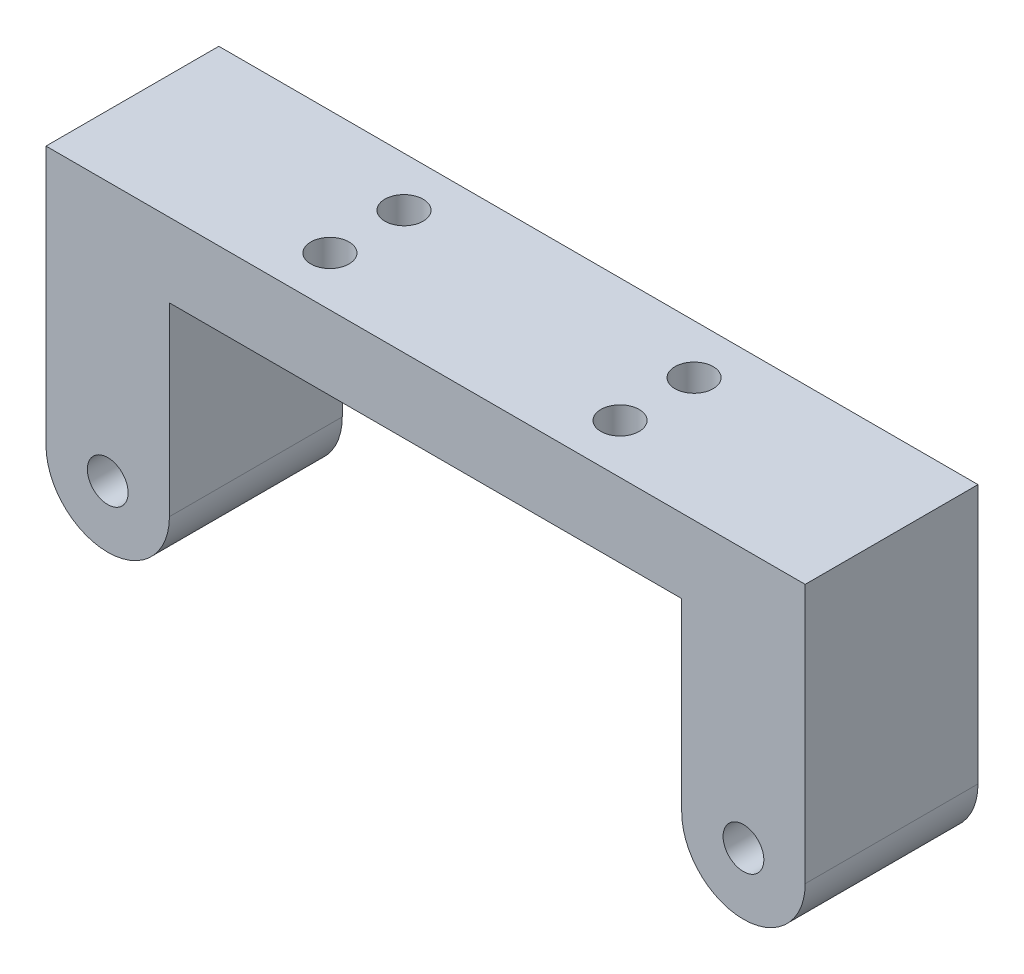
ISO-10303-21;
HEADER;
FILE_DESCRIPTION(('STEP AP214'),'2;1');
FILE_NAME('part.step','',(''),(''),'','','');
FILE_SCHEMA(('AUTOMOTIVE_DESIGN { 1 0 10303 214 1 1 1 1 }'));
ENDSEC;
DATA;
#1=APPLICATION_CONTEXT('core data for automotive mechanical design processes');
#2=APPLICATION_PROTOCOL_DEFINITION('international standard','automotive_design',2000,#1);
#3=PRODUCT_CONTEXT('',#1,'mechanical');
#4=PRODUCT('Part','Part','',(#3));
#5=PRODUCT_RELATED_PRODUCT_CATEGORY('part','',(#4));
#6=PRODUCT_DEFINITION_FORMATION('','',#4);
#7=PRODUCT_DEFINITION_CONTEXT('part definition',#1,'design');
#8=PRODUCT_DEFINITION('design','',#6,#7);
#9=PRODUCT_DEFINITION_SHAPE('','',#8);
#10=(LENGTH_UNIT() NAMED_UNIT(*) SI_UNIT(.MILLI.,.METRE.));
#11=(NAMED_UNIT(*) PLANE_ANGLE_UNIT() SI_UNIT($,.RADIAN.));
#12=(NAMED_UNIT(*) SI_UNIT($,.STERADIAN.) SOLID_ANGLE_UNIT());
#13=UNCERTAINTY_MEASURE_WITH_UNIT(LENGTH_MEASURE(1.E-05),#10,'distance_accuracy_value','');
#14=(GEOMETRIC_REPRESENTATION_CONTEXT(3) GLOBAL_UNCERTAINTY_ASSIGNED_CONTEXT((#13)) GLOBAL_UNIT_ASSIGNED_CONTEXT((#10,
#11,#12)) REPRESENTATION_CONTEXT('',''));
#15=CARTESIAN_POINT('',(0.,0.,0.));
#16=DIRECTION('',(0.,0.,1.));
#17=DIRECTION('',(1.,0.,0.));
#18=AXIS2_PLACEMENT_3D('',#15,#16,#17);
#19=CARTESIAN_POINT('',(0.,0.,0.));
#20=DIRECTION('',(0.,1.,0.));
#21=DIRECTION('',(0.,0.,1.));
#22=AXIS2_PLACEMENT_3D('',#19,#20,#21);
#23=PLANE('',#22);
#24=CARTESIAN_POINT('',(42.5,0.,4.));
#25=DIRECTION('',(0.,1.,0.));
#26=DIRECTION('',(0.,0.,1.));
#27=AXIS2_PLACEMENT_3D('',#24,#25,#26);
#28=CIRCLE('',#27,1.55);
#29=CARTESIAN_POINT('',(42.5,0.,5.55));
#30=VERTEX_POINT('',#29);
#31=EDGE_CURVE('E208',#30,#30,#28,.T.);
#32=ORIENTED_EDGE('',*,*,#31,.T.);
#33=EDGE_LOOP('',(#32));
#34=FACE_BOUND('',#33,.T.);
#35=CARTESIAN_POINT('',(19.0000000000001,0.,10.));
#36=DIRECTION('',(0.,1.,0.));
#37=DIRECTION('',(0.,0.,1.));
#38=AXIS2_PLACEMENT_3D('',#35,#36,#37);
#39=CIRCLE('',#38,1.55);
#40=CARTESIAN_POINT('',(19.0000000000001,0.,11.55));
#41=VERTEX_POINT('',#40);
#42=EDGE_CURVE('E220',#41,#41,#39,.T.);
#43=ORIENTED_EDGE('',*,*,#42,.T.);
#44=EDGE_LOOP('',(#43));
#45=FACE_BOUND('',#44,.T.);
#46=CARTESIAN_POINT('',(42.5000000000001,0.,10.));
#47=DIRECTION('',(0.,1.,0.));
#48=DIRECTION('',(0.,0.,1.));
#49=AXIS2_PLACEMENT_3D('',#46,#47,#48);
#50=CIRCLE('',#49,1.55);
#51=CARTESIAN_POINT('',(42.5000000000001,0.,11.55));
#52=VERTEX_POINT('',#51);
#53=EDGE_CURVE('E213',#52,#52,#50,.T.);
#54=ORIENTED_EDGE('',*,*,#53,.T.);
#55=EDGE_LOOP('',(#54));
#56=FACE_BOUND('',#55,.T.);
#57=CARTESIAN_POINT('',(19.,0.,4.));
#58=DIRECTION('',(0.,1.,0.));
#59=DIRECTION('',(0.,0.,1.));
#60=AXIS2_PLACEMENT_3D('',#57,#58,#59);
#61=CIRCLE('',#60,1.55);
#62=CARTESIAN_POINT('',(19.,0.,5.55));
#63=VERTEX_POINT('',#62);
#64=EDGE_CURVE('E135',#63,#63,#61,.T.);
#65=ORIENTED_EDGE('',*,*,#64,.T.);
#66=EDGE_LOOP('',(#65));
#67=FACE_BOUND('',#66,.T.);
#68=DIRECTION('',(0.,0.,-1.));
#69=VECTOR('',#68,1.);
#70=CARTESIAN_POINT('',(51.5,0.,0.));
#71=LINE('',#70,#69);
#72=CARTESIAN_POINT('',(51.5,0.,14.));
#73=VERTEX_POINT('',#72);
#74=CARTESIAN_POINT('',(51.5,0.,0.));
#75=VERTEX_POINT('',#74);
#76=EDGE_CURVE('E115',#73,#75,#71,.T.);
#77=ORIENTED_EDGE('',*,*,#76,.F.);
#78=DIRECTION('',(1.,0.,0.));
#79=VECTOR('',#78,1.);
#80=CARTESIAN_POINT('',(0.,0.,14.));
#81=LINE('',#80,#79);
#82=CARTESIAN_POINT('',(10.,0.,14.));
#83=VERTEX_POINT('',#82);
#84=EDGE_CURVE('E126',#83,#73,#81,.T.);
#85=ORIENTED_EDGE('',*,*,#84,.F.);
#86=DIRECTION('',(0.,0.,1.));
#87=VECTOR('',#86,1.);
#88=CARTESIAN_POINT('',(10.,0.,0.));
#89=LINE('',#88,#87);
#90=CARTESIAN_POINT('',(10.,0.,0.));
#91=VERTEX_POINT('',#90);
#92=EDGE_CURVE('E120',#91,#83,#89,.T.);
#93=ORIENTED_EDGE('',*,*,#92,.F.);
#94=DIRECTION('',(-1.,0.,0.));
#95=VECTOR('',#94,1.);
#96=CARTESIAN_POINT('',(0.,0.,0.));
#97=LINE('',#96,#95);
#98=EDGE_CURVE('E129',#75,#91,#97,.T.);
#99=ORIENTED_EDGE('',*,*,#98,.F.);
#100=EDGE_LOOP('',(#77,#85,#93,#99));
#101=FACE_BOUND('',#100,.T.);
#102=ADVANCED_FACE('F33',(#34,#45,#56,#67,#101),#23,.F.);
#103=CARTESIAN_POINT('',(0.,6.,0.));
#104=DIRECTION('',(1.,0.,0.));
#105=DIRECTION('',(0.,0.,-1.));
#106=AXIS2_PLACEMENT_3D('',#103,#104,#105);
#107=PLANE('',#106);
#108=DIRECTION('',(0.,-1.,0.));
#109=VECTOR('',#108,1.);
#110=CARTESIAN_POINT('',(0.,6.,0.));
#111=LINE('',#110,#109);
#112=CARTESIAN_POINT('',(0.,6.,0.));
#113=VERTEX_POINT('',#112);
#114=CARTESIAN_POINT('',(0.,-15.,0.));
#115=VERTEX_POINT('',#114);
#116=EDGE_CURVE('E146',#113,#115,#111,.T.);
#117=ORIENTED_EDGE('',*,*,#116,.T.);
#118=DIRECTION('',(0.,0.,-1.));
#119=VECTOR('',#118,1.);
#120=CARTESIAN_POINT('',(0.,-15.,0.));
#121=LINE('',#120,#119);
#122=CARTESIAN_POINT('',(0.,-15.,14.));
#123=VERTEX_POINT('',#122);
#124=EDGE_CURVE('E174',#115,#123,#121,.F.);
#125=ORIENTED_EDGE('',*,*,#124,.T.);
#126=DIRECTION('',(0.,-1.,0.));
#127=VECTOR('',#126,1.);
#128=CARTESIAN_POINT('',(0.,6.,14.));
#129=LINE('',#128,#127);
#130=CARTESIAN_POINT('',(0.,6.,14.));
#131=VERTEX_POINT('',#130);
#132=EDGE_CURVE('E154',#131,#123,#129,.T.);
#133=ORIENTED_EDGE('',*,*,#132,.F.);
#134=DIRECTION('',(0.,0.,1.));
#135=VECTOR('',#134,1.);
#136=CARTESIAN_POINT('',(0.,6.,0.));
#137=LINE('',#136,#135);
#138=EDGE_CURVE('E137',#113,#131,#137,.T.);
#139=ORIENTED_EDGE('',*,*,#138,.F.);
#140=EDGE_LOOP('',(#117,#125,#133,#139));
#141=FACE_BOUND('',#140,.T.);
#142=ADVANCED_FACE('F265',(#141),#107,.F.);
#143=CARTESIAN_POINT('',(0.,6.,14.));
#144=DIRECTION('',(0.,0.,-1.));
#145=DIRECTION('',(-1.,0.,0.));
#146=AXIS2_PLACEMENT_3D('',#143,#144,#145);
#147=PLANE('',#146);
#148=CARTESIAN_POINT('',(56.5,-15.,14.));
#149=DIRECTION('',(0.,0.,-1.));
#150=DIRECTION('',(-1.,0.,0.));
#151=AXIS2_PLACEMENT_3D('',#148,#149,#150);
#152=CIRCLE('',#151,1.65);
#153=CARTESIAN_POINT('',(54.85,-15.,14.));
#154=VERTEX_POINT('',#153);
#155=EDGE_CURVE('E183',#154,#154,#152,.T.);
#156=ORIENTED_EDGE('',*,*,#155,.T.);
#157=EDGE_LOOP('',(#156));
#158=FACE_BOUND('',#157,.T.);
#159=CARTESIAN_POINT('',(5.,-15.,14.));
#160=DIRECTION('',(0.,0.,-1.));
#161=DIRECTION('',(-1.,0.,0.));
#162=AXIS2_PLACEMENT_3D('',#159,#160,#161);
#163=CIRCLE('',#162,1.65);
#164=CARTESIAN_POINT('',(3.35,-15.,14.));
#165=VERTEX_POINT('',#164);
#166=EDGE_CURVE('E130',#165,#165,#163,.T.);
#167=ORIENTED_EDGE('',*,*,#166,.T.);
#168=EDGE_LOOP('',(#167));
#169=FACE_BOUND('',#168,.T.);
#170=CARTESIAN_POINT('',(5.,-15.,14.));
#171=DIRECTION('',(0.,0.,-1.));
#172=DIRECTION('',(-1.,0.,0.));
#173=AXIS2_PLACEMENT_3D('',#170,#171,#172);
#174=CIRCLE('',#173,5.);
#175=CARTESIAN_POINT('',(5.,-20.,14.));
#176=VERTEX_POINT('',#175);
#177=EDGE_CURVE('E161',#123,#176,#174,.F.);
#178=ORIENTED_EDGE('',*,*,#177,.T.);
#179=CARTESIAN_POINT('',(5.,-15.,14.));
#180=DIRECTION('',(0.,0.,-1.));
#181=DIRECTION('',(-1.,0.,0.));
#182=AXIS2_PLACEMENT_3D('',#179,#180,#181);
#183=CIRCLE('',#182,5.);
#184=CARTESIAN_POINT('',(10.,-15.,14.));
#185=VERTEX_POINT('',#184);
#186=EDGE_CURVE('E163',#176,#185,#183,.F.);
#187=ORIENTED_EDGE('',*,*,#186,.T.);
#188=DIRECTION('',(0.,1.,0.));
#189=VECTOR('',#188,1.);
#190=CARTESIAN_POINT('',(10.,-20.,14.));
#191=LINE('',#190,#189);
#192=EDGE_CURVE('E134',#185,#83,#191,.T.);
#193=ORIENTED_EDGE('',*,*,#192,.T.);
#194=ORIENTED_EDGE('',*,*,#84,.T.);
#195=DIRECTION('',(0.,1.,0.));
#196=VECTOR('',#195,1.);
#197=CARTESIAN_POINT('',(51.5,-20.,14.));
#198=LINE('',#197,#196);
#199=CARTESIAN_POINT('',(51.5,-15.,14.));
#200=VERTEX_POINT('',#199);
#201=EDGE_CURVE('E111',#200,#73,#198,.T.);
#202=ORIENTED_EDGE('',*,*,#201,.F.);
#203=CARTESIAN_POINT('',(56.5,-15.,14.));
#204=DIRECTION('',(0.,0.,-1.));
#205=DIRECTION('',(-1.,0.,0.));
#206=AXIS2_PLACEMENT_3D('',#203,#204,#205);
#207=CIRCLE('',#206,5.);
#208=CARTESIAN_POINT('',(56.5,-20.,14.));
#209=VERTEX_POINT('',#208);
#210=EDGE_CURVE('E159',#200,#209,#207,.F.);
#211=ORIENTED_EDGE('',*,*,#210,.T.);
#212=CARTESIAN_POINT('',(56.5,-15.,14.));
#213=DIRECTION('',(0.,0.,-1.));
#214=DIRECTION('',(-1.,0.,0.));
#215=AXIS2_PLACEMENT_3D('',#212,#213,#214);
#216=CIRCLE('',#215,5.);
#217=CARTESIAN_POINT('',(61.5,-15.,14.));
#218=VERTEX_POINT('',#217);
#219=EDGE_CURVE('E157',#209,#218,#216,.F.);
#220=ORIENTED_EDGE('',*,*,#219,.T.);
#221=DIRECTION('',(0.,-1.,0.));
#222=VECTOR('',#221,1.);
#223=CARTESIAN_POINT('',(61.5,6.,14.));
#224=LINE('',#223,#222);
#225=CARTESIAN_POINT('',(61.5,6.,14.));
#226=VERTEX_POINT('',#225);
#227=EDGE_CURVE('E151',#226,#218,#224,.T.);
#228=ORIENTED_EDGE('',*,*,#227,.F.);
#229=DIRECTION('',(1.,0.,0.));
#230=VECTOR('',#229,1.);
#231=CARTESIAN_POINT('',(0.,6.,14.));
#232=LINE('',#231,#230);
#233=EDGE_CURVE('E202',#131,#226,#232,.T.);
#234=ORIENTED_EDGE('',*,*,#233,.F.);
#235=ORIENTED_EDGE('',*,*,#132,.T.);
#236=EDGE_LOOP('',(#178,#187,#193,#194,#202,#211,#220,#228,#234,#235));
#237=FACE_BOUND('',#236,.T.);
#238=ADVANCED_FACE('F132',(#158,#169,#237),#147,.F.);
#239=CARTESIAN_POINT('',(61.5,6.,0.));
#240=DIRECTION('',(-1.,0.,0.));
#241=DIRECTION('',(0.,0.,1.));
#242=AXIS2_PLACEMENT_3D('',#239,#240,#241);
#243=PLANE('',#242);
#244=ORIENTED_EDGE('',*,*,#227,.T.);
#245=DIRECTION('',(0.,0.,1.));
#246=VECTOR('',#245,1.);
#247=CARTESIAN_POINT('',(61.5,-15.,0.));
#248=LINE('',#247,#246);
#249=CARTESIAN_POINT('',(61.5,-15.,0.));
#250=VERTEX_POINT('',#249);
#251=EDGE_CURVE('E11',#218,#250,#248,.F.);
#252=ORIENTED_EDGE('',*,*,#251,.T.);
#253=DIRECTION('',(0.,-1.,0.));
#254=VECTOR('',#253,1.);
#255=CARTESIAN_POINT('',(61.5,6.,0.));
#256=LINE('',#255,#254);
#257=CARTESIAN_POINT('',(61.5,6.,0.));
#258=VERTEX_POINT('',#257);
#259=EDGE_CURVE('E148',#258,#250,#256,.T.);
#260=ORIENTED_EDGE('',*,*,#259,.F.);
#261=DIRECTION('',(0.,0.,-1.));
#262=VECTOR('',#261,1.);
#263=CARTESIAN_POINT('',(61.5,6.,0.));
#264=LINE('',#263,#262);
#265=EDGE_CURVE('E199',#226,#258,#264,.T.);
#266=ORIENTED_EDGE('',*,*,#265,.F.);
#267=EDGE_LOOP('',(#244,#252,#260,#266));
#268=FACE_BOUND('',#267,.T.);
#269=ADVANCED_FACE('F197',(#268),#243,.F.);
#270=CARTESIAN_POINT('',(0.,6.,0.));
#271=DIRECTION('',(0.,0.,1.));
#272=DIRECTION('',(1.,0.,0.));
#273=AXIS2_PLACEMENT_3D('',#270,#271,#272);
#274=PLANE('',#273);
#275=CARTESIAN_POINT('',(56.5,-15.,0.));
#276=DIRECTION('',(0.,0.,-1.));
#277=DIRECTION('',(-1.,0.,0.));
#278=AXIS2_PLACEMENT_3D('',#275,#276,#277);
#279=CIRCLE('',#278,1.65);
#280=CARTESIAN_POINT('',(54.85,-15.,0.));
#281=VERTEX_POINT('',#280);
#282=EDGE_CURVE('E178',#281,#281,#279,.T.);
#283=ORIENTED_EDGE('',*,*,#282,.F.);
#284=EDGE_LOOP('',(#283));
#285=FACE_BOUND('',#284,.T.);
#286=CARTESIAN_POINT('',(5.,-15.,0.));
#287=DIRECTION('',(0.,0.,-1.));
#288=DIRECTION('',(-1.,0.,0.));
#289=AXIS2_PLACEMENT_3D('',#286,#287,#288);
#290=CIRCLE('',#289,1.65);
#291=CARTESIAN_POINT('',(3.35,-15.,0.));
#292=VERTEX_POINT('',#291);
#293=EDGE_CURVE('E232',#292,#292,#290,.T.);
#294=ORIENTED_EDGE('',*,*,#293,.F.);
#295=EDGE_LOOP('',(#294));
#296=FACE_BOUND('',#295,.T.);
#297=DIRECTION('',(0.,1.,0.));
#298=VECTOR('',#297,1.);
#299=CARTESIAN_POINT('',(10.,-20.,0.));
#300=LINE('',#299,#298);
#301=CARTESIAN_POINT('',(10.,-15.,0.));
#302=VERTEX_POINT('',#301);
#303=EDGE_CURVE('E214',#302,#91,#300,.T.);
#304=ORIENTED_EDGE('',*,*,#303,.F.);
#305=CARTESIAN_POINT('',(5.,-15.,0.));
#306=DIRECTION('',(0.,0.,1.));
#307=DIRECTION('',(1.,0.,0.));
#308=AXIS2_PLACEMENT_3D('',#305,#306,#307);
#309=CIRCLE('',#308,5.);
#310=CARTESIAN_POINT('',(5.,-20.,0.));
#311=VERTEX_POINT('',#310);
#312=EDGE_CURVE('E55',#302,#311,#309,.F.);
#313=ORIENTED_EDGE('',*,*,#312,.T.);
#314=CARTESIAN_POINT('',(5.,-15.,0.));
#315=DIRECTION('',(0.,0.,1.));
#316=DIRECTION('',(1.,0.,0.));
#317=AXIS2_PLACEMENT_3D('',#314,#315,#316);
#318=CIRCLE('',#317,5.);
#319=EDGE_CURVE('E50',#311,#115,#318,.F.);
#320=ORIENTED_EDGE('',*,*,#319,.T.);
#321=ORIENTED_EDGE('',*,*,#116,.F.);
#322=DIRECTION('',(-1.,0.,0.));
#323=VECTOR('',#322,1.);
#324=CARTESIAN_POINT('',(0.,6.,0.));
#325=LINE('',#324,#323);
#326=EDGE_CURVE('E143',#258,#113,#325,.T.);
#327=ORIENTED_EDGE('',*,*,#326,.F.);
#328=ORIENTED_EDGE('',*,*,#259,.T.);
#329=CARTESIAN_POINT('',(56.5,-15.,0.));
#330=DIRECTION('',(0.,0.,1.));
#331=DIRECTION('',(1.,0.,0.));
#332=AXIS2_PLACEMENT_3D('',#329,#330,#331);
#333=CIRCLE('',#332,5.);
#334=CARTESIAN_POINT('',(56.5,-20.,0.));
#335=VERTEX_POINT('',#334);
#336=EDGE_CURVE('E168',#250,#335,#333,.F.);
#337=ORIENTED_EDGE('',*,*,#336,.T.);
#338=CARTESIAN_POINT('',(56.5,-15.,0.));
#339=DIRECTION('',(0.,0.,1.));
#340=DIRECTION('',(1.,0.,0.));
#341=AXIS2_PLACEMENT_3D('',#338,#339,#340);
#342=CIRCLE('',#341,5.);
#343=CARTESIAN_POINT('',(51.5,-15.,0.));
#344=VERTEX_POINT('',#343);
#345=EDGE_CURVE('E170',#335,#344,#342,.F.);
#346=ORIENTED_EDGE('',*,*,#345,.T.);
#347=DIRECTION('',(0.,1.,0.));
#348=VECTOR('',#347,1.);
#349=CARTESIAN_POINT('',(51.5,-20.,0.));
#350=LINE('',#349,#348);
#351=EDGE_CURVE('E121',#344,#75,#350,.T.);
#352=ORIENTED_EDGE('',*,*,#351,.T.);
#353=ORIENTED_EDGE('',*,*,#98,.T.);
#354=EDGE_LOOP('',(#304,#313,#320,#321,#327,#328,#337,#346,#352,#353));
#355=FACE_BOUND('',#354,.T.);
#356=ADVANCED_FACE('F250',(#285,#296,#355),#274,.F.);
#357=CARTESIAN_POINT('',(0.,6.,0.));
#358=DIRECTION('',(0.,1.,0.));
#359=DIRECTION('',(0.,0.,1.));
#360=AXIS2_PLACEMENT_3D('',#357,#358,#359);
#361=PLANE('',#360);
#362=CARTESIAN_POINT('',(42.5,6.,4.));
#363=DIRECTION('',(0.,1.,0.));
#364=DIRECTION('',(0.,0.,1.));
#365=AXIS2_PLACEMENT_3D('',#362,#363,#364);
#366=CIRCLE('',#365,1.55);
#367=CARTESIAN_POINT('',(42.5,6.,5.55));
#368=VERTEX_POINT('',#367);
#369=EDGE_CURVE('E223',#368,#368,#366,.T.);
#370=ORIENTED_EDGE('',*,*,#369,.F.);
#371=EDGE_LOOP('',(#370));
#372=FACE_BOUND('',#371,.T.);
#373=CARTESIAN_POINT('',(19.0000000000001,6.,10.));
#374=DIRECTION('',(0.,1.,0.));
#375=DIRECTION('',(0.,0.,1.));
#376=AXIS2_PLACEMENT_3D('',#373,#374,#375);
#377=CIRCLE('',#376,1.55);
#378=CARTESIAN_POINT('',(19.0000000000001,6.,11.55));
#379=VERTEX_POINT('',#378);
#380=EDGE_CURVE('E217',#379,#379,#377,.T.);
#381=ORIENTED_EDGE('',*,*,#380,.F.);
#382=EDGE_LOOP('',(#381));
#383=FACE_BOUND('',#382,.T.);
#384=CARTESIAN_POINT('',(42.5000000000001,6.,10.));
#385=DIRECTION('',(0.,1.,0.));
#386=DIRECTION('',(0.,0.,1.));
#387=AXIS2_PLACEMENT_3D('',#384,#385,#386);
#388=CIRCLE('',#387,1.55);
#389=CARTESIAN_POINT('',(42.5000000000001,6.,11.55));
#390=VERTEX_POINT('',#389);
#391=EDGE_CURVE('E210',#390,#390,#388,.T.);
#392=ORIENTED_EDGE('',*,*,#391,.F.);
#393=EDGE_LOOP('',(#392));
#394=FACE_BOUND('',#393,.T.);
#395=CARTESIAN_POINT('',(19.,6.,4.));
#396=DIRECTION('',(0.,1.,0.));
#397=DIRECTION('',(0.,0.,1.));
#398=AXIS2_PLACEMENT_3D('',#395,#396,#397);
#399=CIRCLE('',#398,1.55);
#400=CARTESIAN_POINT('',(19.,6.,5.55));
#401=VERTEX_POINT('',#400);
#402=EDGE_CURVE('E140',#401,#401,#399,.T.);
#403=ORIENTED_EDGE('',*,*,#402,.F.);
#404=EDGE_LOOP('',(#403));
#405=FACE_BOUND('',#404,.T.);
#406=ORIENTED_EDGE('',*,*,#138,.T.);
#407=ORIENTED_EDGE('',*,*,#233,.T.);
#408=ORIENTED_EDGE('',*,*,#265,.T.);
#409=ORIENTED_EDGE('',*,*,#326,.T.);
#410=EDGE_LOOP('',(#406,#407,#408,#409));
#411=FACE_BOUND('',#410,.T.);
#412=ADVANCED_FACE('F253',(#372,#383,#394,#405,#411),#361,.T.);
#413=CARTESIAN_POINT('',(19.,0.,4.));
#414=DIRECTION('',(0.,1.,0.));
#415=DIRECTION('',(0.,0.,1.));
#416=AXIS2_PLACEMENT_3D('',#413,#414,#415);
#417=CYLINDRICAL_SURFACE('',#416,1.55);
#418=ORIENTED_EDGE('',*,*,#64,.F.);
#419=EDGE_LOOP('',(#418));
#420=FACE_BOUND('',#419,.T.);
#421=ORIENTED_EDGE('',*,*,#402,.T.);
#422=EDGE_LOOP('',(#421));
#423=FACE_BOUND('',#422,.T.);
#424=ADVANCED_FACE('F268',(#420,#423),#417,.F.);
#425=CARTESIAN_POINT('',(42.5000000000001,0.,10.));
#426=DIRECTION('',(0.,1.,0.));
#427=DIRECTION('',(0.,0.,1.));
#428=AXIS2_PLACEMENT_3D('',#425,#426,#427);
#429=CYLINDRICAL_SURFACE('',#428,1.55);
#430=ORIENTED_EDGE('',*,*,#53,.F.);
#431=EDGE_LOOP('',(#430));
#432=FACE_BOUND('',#431,.T.);
#433=ORIENTED_EDGE('',*,*,#391,.T.);
#434=EDGE_LOOP('',(#433));
#435=FACE_BOUND('',#434,.T.);
#436=ADVANCED_FACE('F274',(#432,#435),#429,.F.);
#437=CARTESIAN_POINT('',(19.0000000000001,0.,10.));
#438=DIRECTION('',(0.,1.,0.));
#439=DIRECTION('',(0.,0.,1.));
#440=AXIS2_PLACEMENT_3D('',#437,#438,#439);
#441=CYLINDRICAL_SURFACE('',#440,1.55);
#442=ORIENTED_EDGE('',*,*,#42,.F.);
#443=EDGE_LOOP('',(#442));
#444=FACE_BOUND('',#443,.T.);
#445=ORIENTED_EDGE('',*,*,#380,.T.);
#446=EDGE_LOOP('',(#445));
#447=FACE_BOUND('',#446,.T.);
#448=ADVANCED_FACE('F341',(#444,#447),#441,.F.);
#449=CARTESIAN_POINT('',(42.5,0.,4.));
#450=DIRECTION('',(0.,1.,0.));
#451=DIRECTION('',(0.,0.,1.));
#452=AXIS2_PLACEMENT_3D('',#449,#450,#451);
#453=CYLINDRICAL_SURFACE('',#452,1.55);
#454=ORIENTED_EDGE('',*,*,#31,.F.);
#455=EDGE_LOOP('',(#454));
#456=FACE_BOUND('',#455,.T.);
#457=ORIENTED_EDGE('',*,*,#369,.T.);
#458=EDGE_LOOP('',(#457));
#459=FACE_BOUND('',#458,.T.);
#460=ADVANCED_FACE('F333',(#456,#459),#453,.F.);
#461=CARTESIAN_POINT('',(10.,-20.,0.));
#462=DIRECTION('',(-1.,0.,0.));
#463=DIRECTION('',(0.,0.,1.));
#464=AXIS2_PLACEMENT_3D('',#461,#462,#463);
#465=PLANE('',#464);
#466=ORIENTED_EDGE('',*,*,#192,.F.);
#467=DIRECTION('',(0.,0.,1.));
#468=VECTOR('',#467,1.);
#469=CARTESIAN_POINT('',(10.,-15.,0.));
#470=LINE('',#469,#468);
#471=EDGE_CURVE('E165',#185,#302,#470,.F.);
#472=ORIENTED_EDGE('',*,*,#471,.T.);
#473=ORIENTED_EDGE('',*,*,#303,.T.);
#474=ORIENTED_EDGE('',*,*,#92,.T.);
#475=EDGE_LOOP('',(#466,#472,#473,#474));
#476=FACE_BOUND('',#475,.T.);
#477=ADVANCED_FACE('F257',(#476),#465,.F.);
#478=CARTESIAN_POINT('',(51.5,-20.,0.));
#479=DIRECTION('',(1.,0.,0.));
#480=DIRECTION('',(0.,0.,-1.));
#481=AXIS2_PLACEMENT_3D('',#478,#479,#480);
#482=PLANE('',#481);
#483=ORIENTED_EDGE('',*,*,#351,.F.);
#484=DIRECTION('',(0.,0.,-1.));
#485=VECTOR('',#484,1.);
#486=CARTESIAN_POINT('',(51.5,-15.,14.));
#487=LINE('',#486,#485);
#488=EDGE_CURVE('E42',#344,#200,#487,.F.);
#489=ORIENTED_EDGE('',*,*,#488,.T.);
#490=ORIENTED_EDGE('',*,*,#201,.T.);
#491=ORIENTED_EDGE('',*,*,#76,.T.);
#492=EDGE_LOOP('',(#483,#489,#490,#491));
#493=FACE_BOUND('',#492,.T.);
#494=ADVANCED_FACE('F114',(#493),#482,.F.);
#495=CARTESIAN_POINT('',(5.,-15.,14.));
#496=DIRECTION('',(0.,0.,-1.));
#497=DIRECTION('',(-1.,0.,0.));
#498=AXIS2_PLACEMENT_3D('',#495,#496,#497);
#499=CYLINDRICAL_SURFACE('',#498,1.65);
#500=ORIENTED_EDGE('',*,*,#166,.F.);
#501=EDGE_LOOP('',(#500));
#502=FACE_BOUND('',#501,.T.);
#503=ORIENTED_EDGE('',*,*,#293,.T.);
#504=EDGE_LOOP('',(#503));
#505=FACE_BOUND('',#504,.T.);
#506=ADVANCED_FACE('F246',(#502,#505),#499,.F.);
#507=CARTESIAN_POINT('',(56.5,-15.,14.));
#508=DIRECTION('',(0.,0.,-1.));
#509=DIRECTION('',(-1.,0.,0.));
#510=AXIS2_PLACEMENT_3D('',#507,#508,#509);
#511=CYLINDRICAL_SURFACE('',#510,1.65);
#512=ORIENTED_EDGE('',*,*,#155,.F.);
#513=EDGE_LOOP('',(#512));
#514=FACE_BOUND('',#513,.T.);
#515=ORIENTED_EDGE('',*,*,#282,.T.);
#516=EDGE_LOOP('',(#515));
#517=FACE_BOUND('',#516,.T.);
#518=ADVANCED_FACE('F242',(#514,#517),#511,.F.);
#519=CARTESIAN_POINT('',(5.,-15.,0.));
#520=DIRECTION('',(0.,0.,-1.));
#521=DIRECTION('',(-1.,0.,0.));
#522=AXIS2_PLACEMENT_3D('',#519,#520,#521);
#523=CYLINDRICAL_SURFACE('',#522,5.);
#524=ORIENTED_EDGE('',*,*,#124,.F.);
#525=ORIENTED_EDGE('',*,*,#319,.F.);
#526=DIRECTION('',(0.,0.,-1.));
#527=VECTOR('',#526,1.);
#528=CARTESIAN_POINT('',(5.,-20.,0.));
#529=LINE('',#528,#527);
#530=EDGE_CURVE('E176',#176,#311,#529,.T.);
#531=ORIENTED_EDGE('',*,*,#530,.F.);
#532=ORIENTED_EDGE('',*,*,#177,.F.);
#533=EDGE_LOOP('',(#524,#525,#531,#532));
#534=FACE_BOUND('',#533,.T.);
#535=ADVANCED_FACE('F245',(#534),#523,.T.);
#536=CARTESIAN_POINT('',(5.,-15.,0.));
#537=DIRECTION('',(0.,0.,1.));
#538=DIRECTION('',(1.,0.,0.));
#539=AXIS2_PLACEMENT_3D('',#536,#537,#538);
#540=CYLINDRICAL_SURFACE('',#539,5.);
#541=ORIENTED_EDGE('',*,*,#312,.F.);
#542=ORIENTED_EDGE('',*,*,#471,.F.);
#543=ORIENTED_EDGE('',*,*,#186,.F.);
#544=ORIENTED_EDGE('',*,*,#530,.T.);
#545=EDGE_LOOP('',(#541,#542,#543,#544));
#546=FACE_BOUND('',#545,.T.);
#547=ADVANCED_FACE('F259',(#546),#540,.T.);
#548=CARTESIAN_POINT('',(56.5,-15.,0.));
#549=DIRECTION('',(0.,0.,-1.));
#550=DIRECTION('',(-1.,0.,0.));
#551=AXIS2_PLACEMENT_3D('',#548,#549,#550);
#552=CYLINDRICAL_SURFACE('',#551,5.);
#553=ORIENTED_EDGE('',*,*,#251,.F.);
#554=ORIENTED_EDGE('',*,*,#219,.F.);
#555=DIRECTION('',(0.,0.,1.));
#556=VECTOR('',#555,1.);
#557=CARTESIAN_POINT('',(56.5,-20.,14.));
#558=LINE('',#557,#556);
#559=EDGE_CURVE('E37',#335,#209,#558,.T.);
#560=ORIENTED_EDGE('',*,*,#559,.F.);
#561=ORIENTED_EDGE('',*,*,#336,.F.);
#562=EDGE_LOOP('',(#553,#554,#560,#561));
#563=FACE_BOUND('',#562,.T.);
#564=ADVANCED_FACE('F35',(#563),#552,.T.);
#565=CARTESIAN_POINT('',(56.5,-15.,0.));
#566=DIRECTION('',(0.,0.,1.));
#567=DIRECTION('',(1.,0.,0.));
#568=AXIS2_PLACEMENT_3D('',#565,#566,#567);
#569=CYLINDRICAL_SURFACE('',#568,5.);
#570=ORIENTED_EDGE('',*,*,#210,.F.);
#571=ORIENTED_EDGE('',*,*,#488,.F.);
#572=ORIENTED_EDGE('',*,*,#345,.F.);
#573=ORIENTED_EDGE('',*,*,#559,.T.);
#574=EDGE_LOOP('',(#570,#571,#572,#573));
#575=FACE_BOUND('',#574,.T.);
#576=ADVANCED_FACE('F189',(#575),#569,.T.);
#577=CLOSED_SHELL('',(#102,#142,#238,#269,#356,#412,#424,#436,#448,#460,#477,#494,#506,#518,
#535,#547,#564,#576));
#578=MANIFOLD_SOLID_BREP('B2',#577);
#579=ADVANCED_BREP_SHAPE_REPRESENTATION('',(#18,#578),#14);
#580=SHAPE_DEFINITION_REPRESENTATION(#9,#579);
ENDSEC;
END-ISO-10303-21;
